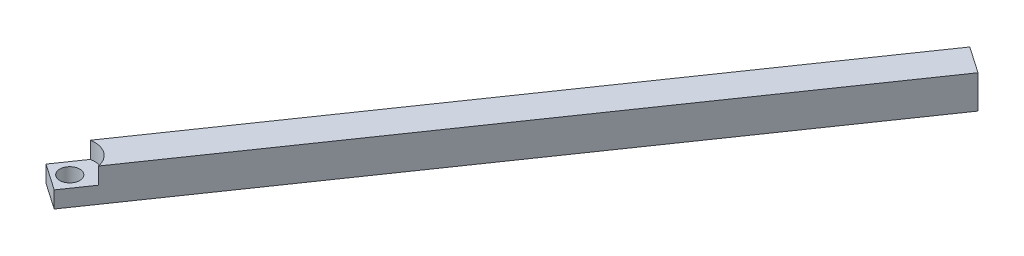
ISO-10303-21;
HEADER;
FILE_DESCRIPTION(('STEP AP214'),'2;1');
FILE_NAME('part.step','',(''),(''),'','','');
FILE_SCHEMA(('AUTOMOTIVE_DESIGN { 1 0 10303 214 1 1 1 1 }'));
ENDSEC;
DATA;
#1=APPLICATION_CONTEXT('core data for automotive mechanical design processes');
#2=APPLICATION_PROTOCOL_DEFINITION('international standard','automotive_design',2000,#1);
#3=PRODUCT_CONTEXT('',#1,'mechanical');
#4=PRODUCT('Part','Part','',(#3));
#5=PRODUCT_RELATED_PRODUCT_CATEGORY('part','',(#4));
#6=PRODUCT_DEFINITION_FORMATION('','',#4);
#7=PRODUCT_DEFINITION_CONTEXT('part definition',#1,'design');
#8=PRODUCT_DEFINITION('design','',#6,#7);
#9=PRODUCT_DEFINITION_SHAPE('','',#8);
#10=(LENGTH_UNIT() NAMED_UNIT(*) SI_UNIT(.MILLI.,.METRE.));
#11=(NAMED_UNIT(*) PLANE_ANGLE_UNIT() SI_UNIT($,.RADIAN.));
#12=(NAMED_UNIT(*) SI_UNIT($,.STERADIAN.) SOLID_ANGLE_UNIT());
#13=UNCERTAINTY_MEASURE_WITH_UNIT(LENGTH_MEASURE(1.E-05),#10,'distance_accuracy_value','');
#14=(GEOMETRIC_REPRESENTATION_CONTEXT(3) GLOBAL_UNCERTAINTY_ASSIGNED_CONTEXT((#13)) GLOBAL_UNIT_ASSIGNED_CONTEXT((#10,
#11,#12)) REPRESENTATION_CONTEXT('',''));
#15=CARTESIAN_POINT('',(0.,0.,0.));
#16=DIRECTION('',(0.,0.,1.));
#17=DIRECTION('',(1.,0.,0.));
#18=AXIS2_PLACEMENT_3D('',#15,#16,#17);
#19=CARTESIAN_POINT('',(0.,5.,0.));
#20=DIRECTION('',(-0.567732858153675,0.,0.823212853260115));
#21=DIRECTION('',(0.823212853260115,0.,0.567732858153675));
#22=AXIS2_PLACEMENT_3D('',#19,#20,#21);
#23=PLANE('',#22);
#24=DIRECTION('',(0.823212853260115,0.,0.567732858153675));
#25=VECTOR('',#24,1.);
#26=CARTESIAN_POINT('',(3.98086745779029,2.5,2.74542513615018));
#27=LINE('',#26,#25);
#28=CARTESIAN_POINT('',(0.,2.5,0.));
#29=VERTEX_POINT('',#28);
#30=CARTESIAN_POINT('',(3.98086745779029,2.5,2.74542513615018));
#31=VERTEX_POINT('',#30);
#32=EDGE_CURVE('E92',#29,#31,#27,.T.);
#33=ORIENTED_EDGE('',*,*,#32,.F.);
#34=DIRECTION('',(0.,-1.,0.));
#35=VECTOR('',#34,1.);
#36=CARTESIAN_POINT('',(0.,5.,0.));
#37=LINE('',#36,#35);
#38=CARTESIAN_POINT('',(0.,0.,0.));
#39=VERTEX_POINT('',#38);
#40=EDGE_CURVE('E85',#29,#39,#37,.T.);
#41=ORIENTED_EDGE('',*,*,#40,.T.);
#42=DIRECTION('',(-0.823212853260115,0.,-0.567732858153675));
#43=VECTOR('',#42,1.);
#44=CARTESIAN_POINT('',(0.,0.,0.));
#45=LINE('',#44,#43);
#46=CARTESIAN_POINT('',(3.9808674577903,0.,2.74542513615018));
#47=VERTEX_POINT('',#46);
#48=EDGE_CURVE('E88',#47,#39,#45,.T.);
#49=ORIENTED_EDGE('',*,*,#48,.F.);
#50=DIRECTION('',(0.,-1.,0.));
#51=VECTOR('',#50,1.);
#52=CARTESIAN_POINT('',(3.9808674577903,5.,2.74542513615018));
#53=LINE('',#52,#51);
#54=EDGE_CURVE('E11',#31,#47,#53,.T.);
#55=ORIENTED_EDGE('',*,*,#54,.F.);
#56=EDGE_LOOP('',(#33,#41,#49,#55));
#57=FACE_BOUND('',#56,.T.);
#58=ADVANCED_FACE('F41',(#57),#23,.T.);
#59=CARTESIAN_POINT('',(3.98086745779029,5.,2.74542513615019));
#60=DIRECTION('',(0.823212853260115,0.,0.567732858153675));
#61=DIRECTION('',(0.567732858153675,0.,-0.823212853260115));
#62=AXIS2_PLACEMENT_3D('',#59,#60,#61);
#63=PLANE('',#62);
#64=DIRECTION('',(0.,1.,0.));
#65=VECTOR('',#64,1.);
#66=CARTESIAN_POINT('',(6.70096250301239,2.5,-1.19871368047239));
#67=LINE('',#66,#65);
#68=CARTESIAN_POINT('',(6.70096250301239,2.5,-1.19871368047239));
#69=VERTEX_POINT('',#68);
#70=CARTESIAN_POINT('',(6.70096250301239,5.,-1.19871368047239));
#71=VERTEX_POINT('',#70);
#72=EDGE_CURVE('E57',#69,#71,#67,.T.);
#73=ORIENTED_EDGE('',*,*,#72,.F.);
#74=DIRECTION('',(0.567732858153675,0.,-0.823212853260115));
#75=VECTOR('',#74,1.);
#76=CARTESIAN_POINT('',(6.70096250301239,2.5,-1.19871368047239));
#77=LINE('',#76,#75);
#78=EDGE_CURVE('E148',#31,#69,#77,.T.);
#79=ORIENTED_EDGE('',*,*,#78,.F.);
#80=ORIENTED_EDGE('',*,*,#54,.T.);
#81=DIRECTION('',(-0.567732858153675,0.,0.823212853260115));
#82=VECTOR('',#81,1.);
#83=CARTESIAN_POINT('',(3.98086745779029,0.,2.74542513615019));
#84=LINE('',#83,#82);
#85=CARTESIAN_POINT('',(60.7541532731578,0.,-79.5758601898613));
#86=VERTEX_POINT('',#85);
#87=EDGE_CURVE('E104',#86,#47,#84,.T.);
#88=ORIENTED_EDGE('',*,*,#87,.F.);
#89=DIRECTION('',(0.,-1.,0.));
#90=VECTOR('',#89,1.);
#91=CARTESIAN_POINT('',(60.7541532731578,5.,-79.5758601898613));
#92=LINE('',#91,#90);
#93=CARTESIAN_POINT('',(60.7541532731578,5.,-79.5758601898613));
#94=VERTEX_POINT('',#93);
#95=EDGE_CURVE('E50',#94,#86,#92,.T.);
#96=ORIENTED_EDGE('',*,*,#95,.F.);
#97=DIRECTION('',(-0.567732858153675,0.,0.823212853260115));
#98=VECTOR('',#97,1.);
#99=CARTESIAN_POINT('',(3.98086745779029,5.,2.74542513615019));
#100=LINE('',#99,#98);
#101=EDGE_CURVE('E111',#94,#71,#100,.T.);
#102=ORIENTED_EDGE('',*,*,#101,.T.);
#103=EDGE_LOOP('',(#73,#79,#80,#88,#96,#102));
#104=FACE_BOUND('',#103,.T.);
#105=ADVANCED_FACE('F130',(#104),#63,.T.);
#106=CARTESIAN_POINT('',(56.7732858153675,5.,-82.3212853260115));
#107=DIRECTION('',(0.567732858153675,0.,-0.823212853260115));
#108=DIRECTION('',(-0.823212853260115,0.,-0.567732858153675));
#109=AXIS2_PLACEMENT_3D('',#106,#107,#108);
#110=PLANE('',#109);
#111=DIRECTION('',(0.823212853260115,0.,0.567732858153675));
#112=VECTOR('',#111,1.);
#113=CARTESIAN_POINT('',(56.7732858153675,0.,-82.3212853260115));
#114=LINE('',#113,#112);
#115=CARTESIAN_POINT('',(56.7732858153675,0.,-82.3212853260115));
#116=VERTEX_POINT('',#115);
#117=EDGE_CURVE('E112',#116,#86,#114,.T.);
#118=ORIENTED_EDGE('',*,*,#117,.F.);
#119=DIRECTION('',(0.,-1.,0.));
#120=VECTOR('',#119,1.);
#121=CARTESIAN_POINT('',(56.7732858153675,5.,-82.3212853260115));
#122=LINE('',#121,#120);
#123=CARTESIAN_POINT('',(56.7732858153675,5.,-82.3212853260115));
#124=VERTEX_POINT('',#123);
#125=EDGE_CURVE('E96',#124,#116,#122,.T.);
#126=ORIENTED_EDGE('',*,*,#125,.F.);
#127=DIRECTION('',(0.823212853260115,0.,0.567732858153675));
#128=VECTOR('',#127,1.);
#129=CARTESIAN_POINT('',(56.7732858153675,5.,-82.3212853260115));
#130=LINE('',#129,#128);
#131=EDGE_CURVE('E117',#124,#94,#130,.T.);
#132=ORIENTED_EDGE('',*,*,#131,.T.);
#133=ORIENTED_EDGE('',*,*,#95,.T.);
#134=EDGE_LOOP('',(#118,#126,#132,#133));
#135=FACE_BOUND('',#134,.T.);
#136=ADVANCED_FACE('F126',(#135),#110,.T.);
#137=CARTESIAN_POINT('',(3.18271452220863,5.,-0.391186569469947));
#138=DIRECTION('',(0.,-1.,0.));
#139=DIRECTION('',(0.,0.,-1.));
#140=AXIS2_PLACEMENT_3D('',#137,#138,#139);
#141=CYLINDRICAL_SURFACE('',#140,1.49969095397824);
#142=CARTESIAN_POINT('',(3.18271452220863,2.5,-0.391186569469947));
#143=DIRECTION('',(0.,-1.,0.));
#144=DIRECTION('',(0.,0.,-1.));
#145=AXIS2_PLACEMENT_3D('',#142,#143,#144);
#146=CIRCLE('',#145,1.49969095397824);
#147=CARTESIAN_POINT('',(3.18271452220863,2.5,-1.89087752344819));
#148=VERTEX_POINT('',#147);
#149=EDGE_CURVE('E137',#148,#148,#146,.T.);
#150=ORIENTED_EDGE('',*,*,#149,.F.);
#151=EDGE_LOOP('',(#150));
#152=FACE_BOUND('',#151,.T.);
#153=CARTESIAN_POINT('',(3.18271452220863,0.,-0.391186569469947));
#154=DIRECTION('',(0.,1.,0.));
#155=DIRECTION('',(0.,0.,1.));
#156=AXIS2_PLACEMENT_3D('',#153,#154,#155);
#157=CIRCLE('',#156,1.49969095397824);
#158=CARTESIAN_POINT('',(3.18271452220863,0.,1.1085043845083));
#159=VERTEX_POINT('',#158);
#160=EDGE_CURVE('E106',#159,#159,#157,.T.);
#161=ORIENTED_EDGE('',*,*,#160,.F.);
#162=EDGE_LOOP('',(#161));
#163=FACE_BOUND('',#162,.T.);
#164=ADVANCED_FACE('F43',(#152,#163),#141,.F.);
#165=CARTESIAN_POINT('',(0.,5.,0.));
#166=DIRECTION('',(-0.823212853260115,0.,-0.567732858153675));
#167=DIRECTION('',(-0.567732858153675,0.,0.823212853260115));
#168=AXIS2_PLACEMENT_3D('',#165,#166,#167);
#169=PLANE('',#168);
#170=DIRECTION('',(0.,1.,0.));
#171=VECTOR('',#170,1.);
#172=CARTESIAN_POINT('',(2.7200950452221,2.5,-3.94413881662257));
#173=LINE('',#172,#171);
#174=CARTESIAN_POINT('',(2.7200950452221,2.5,-3.94413881662257));
#175=VERTEX_POINT('',#174);
#176=CARTESIAN_POINT('',(2.7200950452221,5.,-3.94413881662257));
#177=VERTEX_POINT('',#176);
#178=EDGE_CURVE('E145',#175,#177,#173,.T.);
#179=ORIENTED_EDGE('',*,*,#178,.T.);
#180=DIRECTION('',(0.567732858153675,0.,-0.823212853260115));
#181=VECTOR('',#180,1.);
#182=CARTESIAN_POINT('',(0.,5.,0.));
#183=LINE('',#182,#181);
#184=EDGE_CURVE('E66',#177,#124,#183,.T.);
#185=ORIENTED_EDGE('',*,*,#184,.T.);
#186=ORIENTED_EDGE('',*,*,#125,.T.);
#187=DIRECTION('',(0.567732858153675,0.,-0.823212853260115));
#188=VECTOR('',#187,1.);
#189=CARTESIAN_POINT('',(0.,0.,0.));
#190=LINE('',#189,#188);
#191=EDGE_CURVE('E102',#39,#116,#190,.T.);
#192=ORIENTED_EDGE('',*,*,#191,.F.);
#193=ORIENTED_EDGE('',*,*,#40,.F.);
#194=DIRECTION('',(-0.567732858153675,0.,0.823212853260115));
#195=VECTOR('',#194,1.);
#196=CARTESIAN_POINT('',(0.,2.5,0.));
#197=LINE('',#196,#195);
#198=EDGE_CURVE('E160',#175,#29,#197,.T.);
#199=ORIENTED_EDGE('',*,*,#198,.F.);
#200=EDGE_LOOP('',(#179,#185,#186,#192,#193,#199));
#201=FACE_BOUND('',#200,.T.);
#202=ADVANCED_FACE('F108',(#201),#169,.T.);
#203=CARTESIAN_POINT('',(0.,5.,0.));
#204=DIRECTION('',(0.,1.,0.));
#205=DIRECTION('',(0.,0.,1.));
#206=AXIS2_PLACEMENT_3D('',#203,#204,#205);
#207=PLANE('',#206);
#208=CARTESIAN_POINT('',(3.33781620604187,5.,-0.580992519651917));
#209=DIRECTION('',(0.,1.,0.));
#210=DIRECTION('',(0.,0.,-1.));
#211=AXIS2_PLACEMENT_3D('',#208,#209,#210);
#212=CIRCLE('',#211,3.41940527685034);
#213=EDGE_CURVE('E151',#71,#177,#212,.T.);
#214=ORIENTED_EDGE('',*,*,#213,.F.);
#215=ORIENTED_EDGE('',*,*,#101,.F.);
#216=ORIENTED_EDGE('',*,*,#131,.F.);
#217=ORIENTED_EDGE('',*,*,#184,.F.);
#218=EDGE_LOOP('',(#214,#215,#216,#217));
#219=FACE_BOUND('',#218,.T.);
#220=ADVANCED_FACE('F173',(#219),#207,.T.);
#221=CARTESIAN_POINT('',(0.,0.,0.));
#222=DIRECTION('',(0.,1.,0.));
#223=DIRECTION('',(0.,0.,1.));
#224=AXIS2_PLACEMENT_3D('',#221,#222,#223);
#225=PLANE('',#224);
#226=ORIENTED_EDGE('',*,*,#160,.T.);
#227=EDGE_LOOP('',(#226));
#228=FACE_BOUND('',#227,.T.);
#229=ORIENTED_EDGE('',*,*,#48,.T.);
#230=ORIENTED_EDGE('',*,*,#191,.T.);
#231=ORIENTED_EDGE('',*,*,#117,.T.);
#232=ORIENTED_EDGE('',*,*,#87,.T.);
#233=EDGE_LOOP('',(#229,#230,#231,#232));
#234=FACE_BOUND('',#233,.T.);
#235=ADVANCED_FACE('F100',(#228,#234),#225,.F.);
#236=CARTESIAN_POINT('',(3.33781620604187,2.5,-0.580992519651917));
#237=DIRECTION('',(0.,1.,0.));
#238=DIRECTION('',(0.,0.,1.));
#239=AXIS2_PLACEMENT_3D('',#236,#237,#238);
#240=CYLINDRICAL_SURFACE('',#239,3.41940527685034);
#241=ORIENTED_EDGE('',*,*,#213,.T.);
#242=ORIENTED_EDGE('',*,*,#178,.F.);
#243=CARTESIAN_POINT('',(3.33781620604187,2.5,-0.580992519651917));
#244=DIRECTION('',(0.,1.,0.));
#245=DIRECTION('',(0.,0.,-1.));
#246=AXIS2_PLACEMENT_3D('',#243,#244,#245);
#247=CIRCLE('',#246,3.41940527685034);
#248=EDGE_CURVE('E154',#69,#175,#247,.T.);
#249=ORIENTED_EDGE('',*,*,#248,.F.);
#250=ORIENTED_EDGE('',*,*,#72,.T.);
#251=EDGE_LOOP('',(#241,#242,#249,#250));
#252=FACE_BOUND('',#251,.T.);
#253=ADVANCED_FACE('F178',(#252),#240,.F.);
#254=CARTESIAN_POINT('',(3.33781620604187,2.5,-0.580992519651917));
#255=DIRECTION('',(0.,-1.,0.));
#256=DIRECTION('',(0.,0.,-1.));
#257=AXIS2_PLACEMENT_3D('',#254,#255,#256);
#258=PLANE('',#257);
#259=ORIENTED_EDGE('',*,*,#149,.T.);
#260=EDGE_LOOP('',(#259));
#261=FACE_BOUND('',#260,.T.);
#262=ORIENTED_EDGE('',*,*,#248,.T.);
#263=ORIENTED_EDGE('',*,*,#198,.T.);
#264=ORIENTED_EDGE('',*,*,#32,.T.);
#265=ORIENTED_EDGE('',*,*,#78,.T.);
#266=EDGE_LOOP('',(#262,#263,#264,#265));
#267=FACE_BOUND('',#266,.T.);
#268=ADVANCED_FACE('F168',(#261,#267),#258,.F.);
#269=CLOSED_SHELL('',(#58,#105,#136,#164,#202,#220,#235,#253,#268));
#270=MANIFOLD_SOLID_BREP('B2',#269);
#271=ADVANCED_BREP_SHAPE_REPRESENTATION('',(#18,#270),#14);
#272=SHAPE_DEFINITION_REPRESENTATION(#9,#271);
ENDSEC;
END-ISO-10303-21;
